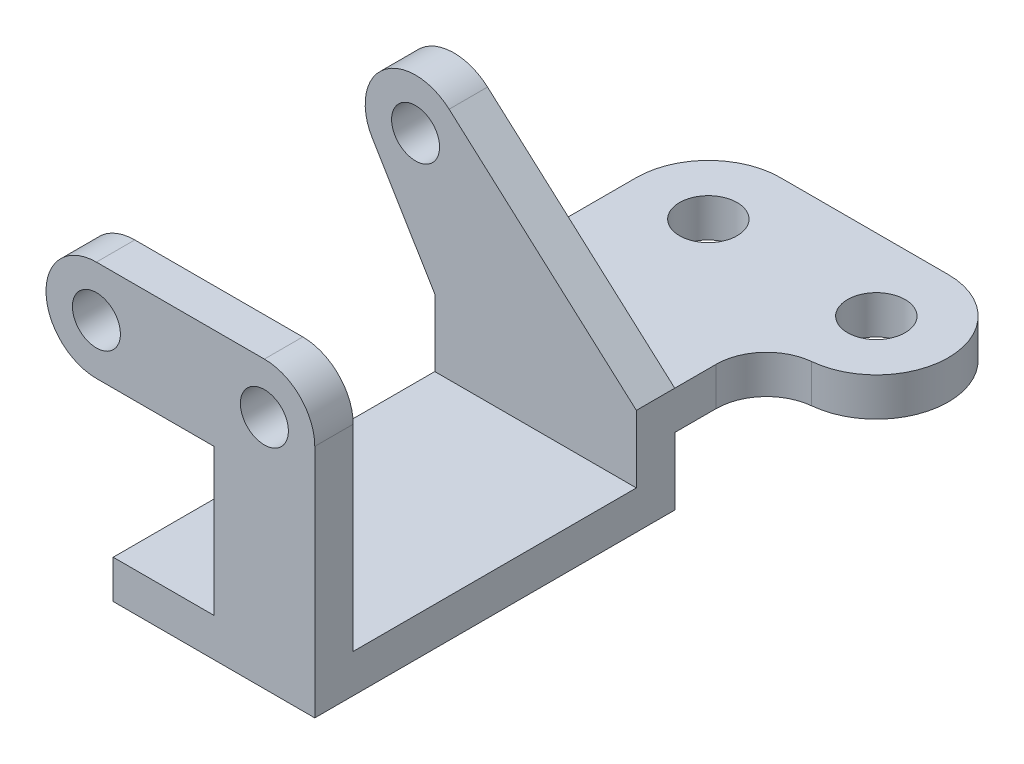
ISO-10303-21;
HEADER;
FILE_DESCRIPTION(('STEP AP214'),'2;1');
FILE_NAME('part.step','',(''),(''),'','','');
FILE_SCHEMA(('AUTOMOTIVE_DESIGN { 1 0 10303 214 1 1 1 1 }'));
ENDSEC;
DATA;
#1=APPLICATION_CONTEXT('core data for automotive mechanical design processes');
#2=APPLICATION_PROTOCOL_DEFINITION('international standard','automotive_design',2000,#1);
#3=PRODUCT_CONTEXT('',#1,'mechanical');
#4=PRODUCT('Part','Part','',(#3));
#5=PRODUCT_RELATED_PRODUCT_CATEGORY('part','',(#4));
#6=PRODUCT_DEFINITION_FORMATION('','',#4);
#7=PRODUCT_DEFINITION_CONTEXT('part definition',#1,'design');
#8=PRODUCT_DEFINITION('design','',#6,#7);
#9=PRODUCT_DEFINITION_SHAPE('','',#8);
#10=(LENGTH_UNIT() NAMED_UNIT(*) SI_UNIT(.MILLI.,.METRE.));
#11=(NAMED_UNIT(*) PLANE_ANGLE_UNIT() SI_UNIT($,.RADIAN.));
#12=(NAMED_UNIT(*) SI_UNIT($,.STERADIAN.) SOLID_ANGLE_UNIT());
#13=UNCERTAINTY_MEASURE_WITH_UNIT(LENGTH_MEASURE(1.E-05),#10,'distance_accuracy_value','');
#14=(GEOMETRIC_REPRESENTATION_CONTEXT(3) GLOBAL_UNCERTAINTY_ASSIGNED_CONTEXT((#13)) GLOBAL_UNIT_ASSIGNED_CONTEXT((#10,
#11,#12)) REPRESENTATION_CONTEXT('',''));
#15=CARTESIAN_POINT('',(0.,0.,0.));
#16=DIRECTION('',(0.,0.,1.));
#17=DIRECTION('',(1.,0.,0.));
#18=AXIS2_PLACEMENT_3D('',#15,#16,#17);
#19=CARTESIAN_POINT('',(42.,0.,0.));
#20=DIRECTION('',(0.,-1.,0.));
#21=DIRECTION('',(0.,0.,-1.));
#22=AXIS2_PLACEMENT_3D('',#19,#20,#21);
#23=PLANE('',#22);
#24=DIRECTION('',(0.,0.,1.));
#25=VECTOR('',#24,1.);
#26=CARTESIAN_POINT('',(0.,0.,118.));
#27=LINE('',#26,#25);
#28=CARTESIAN_POINT('',(0.,0.,118.));
#29=VERTEX_POINT('',#28);
#30=CARTESIAN_POINT('',(0.,0.,134.));
#31=VERTEX_POINT('',#30);
#32=EDGE_CURVE('E223',#29,#31,#27,.T.);
#33=ORIENTED_EDGE('',*,*,#32,.F.);
#34=DIRECTION('',(-1.,0.,0.));
#35=VECTOR('',#34,1.);
#36=CARTESIAN_POINT('',(0.,0.,118.));
#37=LINE('',#36,#35);
#38=CARTESIAN_POINT('',(42.,0.,118.));
#39=VERTEX_POINT('',#38);
#40=EDGE_CURVE('E180',#39,#29,#37,.T.);
#41=ORIENTED_EDGE('',*,*,#40,.F.);
#42=DIRECTION('',(0.,0.,1.));
#43=VECTOR('',#42,1.);
#44=CARTESIAN_POINT('',(42.,0.,0.));
#45=LINE('',#44,#43);
#46=CARTESIAN_POINT('',(42.,0.,0.));
#47=VERTEX_POINT('',#46);
#48=EDGE_CURVE('E187',#47,#39,#45,.T.);
#49=ORIENTED_EDGE('',*,*,#48,.F.);
#50=DIRECTION('',(-1.,0.,0.));
#51=VECTOR('',#50,1.);
#52=CARTESIAN_POINT('',(42.,0.,0.));
#53=LINE('',#52,#51);
#54=CARTESIAN_POINT('',(-42.,0.,0.));
#55=VERTEX_POINT('',#54);
#56=EDGE_CURVE('E343',#47,#55,#53,.T.);
#57=ORIENTED_EDGE('',*,*,#56,.T.);
#58=DIRECTION('',(0.,0.,1.));
#59=VECTOR('',#58,1.);
#60=CARTESIAN_POINT('',(-42.,0.,0.));
#61=LINE('',#60,#59);
#62=CARTESIAN_POINT('',(-42.,0.,134.));
#63=VERTEX_POINT('',#62);
#64=EDGE_CURVE('E318',#55,#63,#61,.T.);
#65=ORIENTED_EDGE('',*,*,#64,.T.);
#66=DIRECTION('',(-1.,0.,0.));
#67=VECTOR('',#66,1.);
#68=CARTESIAN_POINT('',(42.,0.,134.));
#69=LINE('',#68,#67);
#70=EDGE_CURVE('E341',#31,#63,#69,.T.);
#71=ORIENTED_EDGE('',*,*,#70,.F.);
#72=EDGE_LOOP('',(#33,#41,#49,#57,#65,#71));
#73=FACE_BOUND('',#72,.T.);
#74=ADVANCED_FACE('F35',(#73),#23,.F.);
#75=CARTESIAN_POINT('',(42.,28.,-84.));
#76=DIRECTION('',(0.,-1.,0.));
#77=DIRECTION('',(0.,0.,-1.));
#78=AXIS2_PLACEMENT_3D('',#75,#76,#77);
#79=PLANE('',#78);
#80=CARTESIAN_POINT('',(58.,28.,-84.));
#81=DIRECTION('',(0.,1.,0.));
#82=DIRECTION('',(0.,0.,1.));
#83=AXIS2_PLACEMENT_3D('',#80,#81,#82);
#84=CIRCLE('',#83,12.);
#85=CARTESIAN_POINT('',(58.,28.,-72.));
#86=VERTEX_POINT('',#85);
#87=EDGE_CURVE('E233',#86,#86,#84,.T.);
#88=ORIENTED_EDGE('',*,*,#87,.F.);
#89=EDGE_LOOP('',(#88));
#90=FACE_BOUND('',#89,.T.);
#91=CARTESIAN_POINT('',(-12.,28.,-84.));
#92=DIRECTION('',(0.,1.,0.));
#93=DIRECTION('',(0.,0.,1.));
#94=AXIS2_PLACEMENT_3D('',#91,#92,#93);
#95=CIRCLE('',#94,12.);
#96=CARTESIAN_POINT('',(-12.,28.,-72.));
#97=VERTEX_POINT('',#96);
#98=EDGE_CURVE('E237',#97,#97,#95,.T.);
#99=ORIENTED_EDGE('',*,*,#98,.F.);
#100=EDGE_LOOP('',(#99));
#101=FACE_BOUND('',#100,.T.);
#102=DIRECTION('',(0.,0.,1.));
#103=VECTOR('',#102,1.);
#104=CARTESIAN_POINT('',(42.,28.,-84.));
#105=LINE('',#104,#103);
#106=CARTESIAN_POINT('',(42.,28.,-33.245689838202));
#107=VERTEX_POINT('',#106);
#108=CARTESIAN_POINT('',(42.,28.,-16.));
#109=VERTEX_POINT('',#108);
#110=EDGE_CURVE('E313',#107,#109,#105,.T.);
#111=ORIENTED_EDGE('',*,*,#110,.F.);
#112=CARTESIAN_POINT('',(63.,28.,-33.245689838202));
#113=DIRECTION('',(0.,-1.,0.));
#114=DIRECTION('',(0.,0.,-1.));
#115=AXIS2_PLACEMENT_3D('',#112,#113,#114);
#116=CIRCLE('',#115,21.);
#117=CARTESIAN_POINT('',(60.9411764705882,28.,-54.1445234342365));
#118=VERTEX_POINT('',#117);
#119=EDGE_CURVE('E43',#107,#118,#116,.T.);
#120=ORIENTED_EDGE('',*,*,#119,.T.);
#121=CARTESIAN_POINT('',(58.,28.,-84.));
#122=DIRECTION('',(0.,1.,0.));
#123=DIRECTION('',(0.,0.,1.));
#124=AXIS2_PLACEMENT_3D('',#121,#122,#123);
#125=CIRCLE('',#124,30.);
#126=CARTESIAN_POINT('',(58.,28.,-114.));
#127=VERTEX_POINT('',#126);
#128=EDGE_CURVE('E249',#118,#127,#125,.T.);
#129=ORIENTED_EDGE('',*,*,#128,.T.);
#130=DIRECTION('',(1.,0.,0.));
#131=VECTOR('',#130,1.);
#132=CARTESIAN_POINT('',(0.,28.,-114.));
#133=LINE('',#132,#131);
#134=CARTESIAN_POINT('',(-12.,28.,-114.));
#135=VERTEX_POINT('',#134);
#136=EDGE_CURVE('E240',#135,#127,#133,.T.);
#137=ORIENTED_EDGE('',*,*,#136,.F.);
#138=CARTESIAN_POINT('',(-12.,28.,-84.));
#139=DIRECTION('',(0.,1.,0.));
#140=DIRECTION('',(0.,0.,1.));
#141=AXIS2_PLACEMENT_3D('',#138,#139,#140);
#142=CIRCLE('',#141,30.);
#143=CARTESIAN_POINT('',(-42.,28.,-84.));
#144=VERTEX_POINT('',#143);
#145=EDGE_CURVE('E257',#135,#144,#142,.T.);
#146=ORIENTED_EDGE('',*,*,#145,.T.);
#147=DIRECTION('',(0.,0.,1.));
#148=VECTOR('',#147,1.);
#149=CARTESIAN_POINT('',(-42.,28.,-84.));
#150=LINE('',#149,#148);
#151=CARTESIAN_POINT('',(-42.,28.,-16.));
#152=VERTEX_POINT('',#151);
#153=EDGE_CURVE('E303',#144,#152,#150,.T.);
#154=ORIENTED_EDGE('',*,*,#153,.T.);
#155=DIRECTION('',(-1.,0.,0.));
#156=VECTOR('',#155,1.);
#157=CARTESIAN_POINT('',(0.,28.,-16.));
#158=LINE('',#157,#156);
#159=EDGE_CURVE('E281',#109,#152,#158,.T.);
#160=ORIENTED_EDGE('',*,*,#159,.F.);
#161=EDGE_LOOP('',(#111,#120,#129,#137,#146,#154,#160));
#162=FACE_BOUND('',#161,.T.);
#163=ADVANCED_FACE('F354',(#90,#101,#162),#79,.F.);
#164=CARTESIAN_POINT('',(42.,28.,0.));
#165=DIRECTION('',(0.,0.,-1.));
#166=DIRECTION('',(0.,1.,0.));
#167=AXIS2_PLACEMENT_3D('',#164,#165,#166);
#168=PLANE('',#167);
#169=CARTESIAN_POINT('',(-50.,82.,0.));
#170=DIRECTION('',(0.,0.,1.));
#171=DIRECTION('',(1.,0.,0.));
#172=AXIS2_PLACEMENT_3D('',#169,#170,#171);
#173=CIRCLE('',#172,10.);
#174=CARTESIAN_POINT('',(-40.,82.,0.));
#175=VERTEX_POINT('',#174);
#176=EDGE_CURVE('E264',#175,#175,#173,.T.);
#177=ORIENTED_EDGE('',*,*,#176,.F.);
#178=EDGE_LOOP('',(#177));
#179=FACE_BOUND('',#178,.T.);
#180=DIRECTION('',(0.,-1.,0.));
#181=VECTOR('',#180,1.);
#182=CARTESIAN_POINT('',(-42.,28.,0.));
#183=LINE('',#182,#181);
#184=CARTESIAN_POINT('',(-42.,28.,0.));
#185=VERTEX_POINT('',#184);
#186=EDGE_CURVE('E294',#185,#55,#183,.T.);
#187=ORIENTED_EDGE('',*,*,#186,.T.);
#188=ORIENTED_EDGE('',*,*,#56,.F.);
#189=DIRECTION('',(0.,-1.,0.));
#190=VECTOR('',#189,1.);
#191=CARTESIAN_POINT('',(42.,28.,0.));
#192=LINE('',#191,#190);
#193=CARTESIAN_POINT('',(42.,28.,0.));
#194=VERTEX_POINT('',#193);
#195=EDGE_CURVE('E301',#194,#47,#192,.T.);
#196=ORIENTED_EDGE('',*,*,#195,.F.);
#197=DIRECTION('',(-0.745891919922251,0.666066996476104,0.));
#198=VECTOR('',#197,1.);
#199=CARTESIAN_POINT('',(32.5438919817328,36.4441207872816,0.));
#200=LINE('',#199,#198);
#201=CARTESIAN_POINT('',(-36.0125930740018,97.6637303183673,0.));
#202=VERTEX_POINT('',#201);
#203=EDGE_CURVE('E271',#194,#202,#200,.T.);
#204=ORIENTED_EDGE('',*,*,#203,.T.);
#205=CARTESIAN_POINT('',(-50.,82.,0.));
#206=DIRECTION('',(0.,0.,1.));
#207=DIRECTION('',(1.,0.,0.));
#208=AXIS2_PLACEMENT_3D('',#205,#206,#207);
#209=CIRCLE('',#208,21.);
#210=CARTESIAN_POINT('',(-67.9907880905346,71.1680313939949,0.));
#211=VERTEX_POINT('',#210);
#212=EDGE_CURVE('E287',#202,#211,#209,.T.);
#213=ORIENTED_EDGE('',*,*,#212,.T.);
#214=DIRECTION('',(-0.515808028857387,0.856704194787359,0.));
#215=VECTOR('',#214,1.);
#216=CARTESIAN_POINT('',(-18.4525099926234,-11.1099640513943,0.));
#217=LINE('',#216,#215);
#218=EDGE_CURVE('E276',#185,#211,#217,.T.);
#219=ORIENTED_EDGE('',*,*,#218,.F.);
#220=EDGE_LOOP('',(#187,#188,#196,#204,#213,#219));
#221=FACE_BOUND('',#220,.T.);
#222=ADVANCED_FACE('F372',(#179,#221),#168,.F.);
#223=CARTESIAN_POINT('',(42.,0.,134.));
#224=DIRECTION('',(0.,0.,-1.));
#225=DIRECTION('',(-1.,0.,0.));
#226=AXIS2_PLACEMENT_3D('',#223,#224,#225);
#227=PLANE('',#226);
#228=CARTESIAN_POINT('',(-49.,82.,134.));
#229=DIRECTION('',(0.,0.,1.));
#230=DIRECTION('',(1.,0.,0.));
#231=AXIS2_PLACEMENT_3D('',#228,#229,#230);
#232=CIRCLE('',#231,10.);
#233=CARTESIAN_POINT('',(-39.,82.,134.));
#234=VERTEX_POINT('',#233);
#235=EDGE_CURVE('E670',#234,#234,#232,.T.);
#236=ORIENTED_EDGE('',*,*,#235,.F.);
#237=EDGE_LOOP('',(#236));
#238=FACE_BOUND('',#237,.T.);
#239=CARTESIAN_POINT('',(21.,82.,134.));
#240=DIRECTION('',(0.,0.,1.));
#241=DIRECTION('',(1.,0.,0.));
#242=AXIS2_PLACEMENT_3D('',#239,#240,#241);
#243=CIRCLE('',#242,10.);
#244=CARTESIAN_POINT('',(31.,82.,134.));
#245=VERTEX_POINT('',#244);
#246=EDGE_CURVE('E671',#245,#245,#243,.T.);
#247=ORIENTED_EDGE('',*,*,#246,.F.);
#248=EDGE_LOOP('',(#247));
#249=FACE_BOUND('',#248,.T.);
#250=DIRECTION('',(0.,-1.,0.));
#251=VECTOR('',#250,1.);
#252=CARTESIAN_POINT('',(-42.,0.,134.));
#253=LINE('',#252,#251);
#254=CARTESIAN_POINT('',(-42.,-16.,134.));
#255=VERTEX_POINT('',#254);
#256=EDGE_CURVE('E321',#63,#255,#253,.T.);
#257=ORIENTED_EDGE('',*,*,#256,.T.);
#258=DIRECTION('',(-1.,0.,0.));
#259=VECTOR('',#258,1.);
#260=CARTESIAN_POINT('',(42.,-16.,134.));
#261=LINE('',#260,#259);
#262=CARTESIAN_POINT('',(42.,-16.,134.));
#263=VERTEX_POINT('',#262);
#264=EDGE_CURVE('E338',#263,#255,#261,.T.);
#265=ORIENTED_EDGE('',*,*,#264,.F.);
#266=DIRECTION('',(0.,-1.,0.));
#267=VECTOR('',#266,1.);
#268=CARTESIAN_POINT('',(42.,0.,134.));
#269=LINE('',#268,#267);
#270=CARTESIAN_POINT('',(42.,82.,134.));
#271=VERTEX_POINT('',#270);
#272=EDGE_CURVE('E305',#271,#263,#269,.T.);
#273=ORIENTED_EDGE('',*,*,#272,.F.);
#274=CARTESIAN_POINT('',(21.,82.,134.));
#275=DIRECTION('',(0.,0.,1.));
#276=DIRECTION('',(1.,0.,0.));
#277=AXIS2_PLACEMENT_3D('',#274,#275,#276);
#278=CIRCLE('',#277,21.);
#279=CARTESIAN_POINT('',(21.,103.,134.));
#280=VERTEX_POINT('',#279);
#281=EDGE_CURVE('E177',#271,#280,#278,.T.);
#282=ORIENTED_EDGE('',*,*,#281,.T.);
#283=DIRECTION('',(1.,0.,0.));
#284=VECTOR('',#283,1.);
#285=CARTESIAN_POINT('',(0.,103.,134.));
#286=LINE('',#285,#284);
#287=CARTESIAN_POINT('',(-49.,103.,134.));
#288=VERTEX_POINT('',#287);
#289=EDGE_CURVE('E211',#288,#280,#286,.T.);
#290=ORIENTED_EDGE('',*,*,#289,.F.);
#291=CARTESIAN_POINT('',(-49.,82.,134.));
#292=DIRECTION('',(0.,0.,1.));
#293=DIRECTION('',(1.,0.,0.));
#294=AXIS2_PLACEMENT_3D('',#291,#292,#293);
#295=CIRCLE('',#294,21.);
#296=CARTESIAN_POINT('',(-49.,61.,134.));
#297=VERTEX_POINT('',#296);
#298=EDGE_CURVE('E215',#288,#297,#295,.T.);
#299=ORIENTED_EDGE('',*,*,#298,.T.);
#300=DIRECTION('',(1.,0.,0.));
#301=VECTOR('',#300,1.);
#302=CARTESIAN_POINT('',(0.,61.,134.));
#303=LINE('',#302,#301);
#304=CARTESIAN_POINT('',(0.,61.,134.));
#305=VERTEX_POINT('',#304);
#306=EDGE_CURVE('E218',#297,#305,#303,.T.);
#307=ORIENTED_EDGE('',*,*,#306,.T.);
#308=DIRECTION('',(0.,1.,0.));
#309=VECTOR('',#308,1.);
#310=CARTESIAN_POINT('',(0.,0.,134.));
#311=LINE('',#310,#309);
#312=EDGE_CURVE('E190',#31,#305,#311,.T.);
#313=ORIENTED_EDGE('',*,*,#312,.F.);
#314=ORIENTED_EDGE('',*,*,#70,.T.);
#315=EDGE_LOOP('',(#257,#265,#273,#282,#290,#299,#307,#313,#314));
#316=FACE_BOUND('',#315,.T.);
#317=ADVANCED_FACE('F394',(#238,#249,#316),#227,.F.);
#318=CARTESIAN_POINT('',(42.,-16.,134.));
#319=DIRECTION('',(0.,1.,0.));
#320=DIRECTION('',(0.,0.,1.));
#321=AXIS2_PLACEMENT_3D('',#318,#319,#320);
#322=PLANE('',#321);
#323=DIRECTION('',(0.,0.,-1.));
#324=VECTOR('',#323,1.);
#325=CARTESIAN_POINT('',(-42.,-16.,134.));
#326=LINE('',#325,#324);
#327=CARTESIAN_POINT('',(-42.,-16.,-16.));
#328=VERTEX_POINT('',#327);
#329=EDGE_CURVE('E323',#255,#328,#326,.T.);
#330=ORIENTED_EDGE('',*,*,#329,.T.);
#331=DIRECTION('',(-1.,0.,0.));
#332=VECTOR('',#331,1.);
#333=CARTESIAN_POINT('',(42.,-16.,-16.));
#334=LINE('',#333,#332);
#335=CARTESIAN_POINT('',(42.,-16.,-16.));
#336=VERTEX_POINT('',#335);
#337=EDGE_CURVE('E335',#336,#328,#334,.T.);
#338=ORIENTED_EDGE('',*,*,#337,.F.);
#339=DIRECTION('',(0.,0.,-1.));
#340=VECTOR('',#339,1.);
#341=CARTESIAN_POINT('',(42.,-16.,134.));
#342=LINE('',#341,#340);
#343=EDGE_CURVE('E307',#263,#336,#342,.T.);
#344=ORIENTED_EDGE('',*,*,#343,.F.);
#345=ORIENTED_EDGE('',*,*,#264,.T.);
#346=EDGE_LOOP('',(#330,#338,#344,#345));
#347=FACE_BOUND('',#346,.T.);
#348=ADVANCED_FACE('F401',(#347),#322,.F.);
#349=CARTESIAN_POINT('',(42.,-16.,-16.));
#350=DIRECTION('',(0.,0.,1.));
#351=DIRECTION('',(0.,-1.,0.));
#352=AXIS2_PLACEMENT_3D('',#349,#350,#351);
#353=PLANE('',#352);
#354=DIRECTION('',(0.,1.,0.));
#355=VECTOR('',#354,1.);
#356=CARTESIAN_POINT('',(-42.,-16.,-16.));
#357=LINE('',#356,#355);
#358=CARTESIAN_POINT('',(-42.,12.,-16.));
#359=VERTEX_POINT('',#358);
#360=EDGE_CURVE('E325',#328,#359,#357,.T.);
#361=ORIENTED_EDGE('',*,*,#360,.T.);
#362=DIRECTION('',(-1.,0.,0.));
#363=VECTOR('',#362,1.);
#364=CARTESIAN_POINT('',(42.,12.,-16.));
#365=LINE('',#364,#363);
#366=CARTESIAN_POINT('',(42.,12.,-16.));
#367=VERTEX_POINT('',#366);
#368=EDGE_CURVE('E315',#367,#359,#365,.T.);
#369=ORIENTED_EDGE('',*,*,#368,.F.);
#370=DIRECTION('',(0.,1.,0.));
#371=VECTOR('',#370,1.);
#372=CARTESIAN_POINT('',(42.,-16.,-16.));
#373=LINE('',#372,#371);
#374=EDGE_CURVE('E309',#336,#367,#373,.T.);
#375=ORIENTED_EDGE('',*,*,#374,.F.);
#376=ORIENTED_EDGE('',*,*,#337,.T.);
#377=EDGE_LOOP('',(#361,#369,#375,#376));
#378=FACE_BOUND('',#377,.T.);
#379=ADVANCED_FACE('F405',(#378),#353,.F.);
#380=CARTESIAN_POINT('',(42.,12.,-16.));
#381=DIRECTION('',(0.,1.,0.));
#382=DIRECTION('',(0.,0.,1.));
#383=AXIS2_PLACEMENT_3D('',#380,#381,#382);
#384=PLANE('',#383);
#385=CARTESIAN_POINT('',(58.,12.,-84.));
#386=DIRECTION('',(0.,1.,0.));
#387=DIRECTION('',(0.,0.,1.));
#388=AXIS2_PLACEMENT_3D('',#385,#386,#387);
#389=CIRCLE('',#388,12.);
#390=CARTESIAN_POINT('',(58.,12.,-72.));
#391=VERTEX_POINT('',#390);
#392=EDGE_CURVE('E236',#391,#391,#389,.F.);
#393=ORIENTED_EDGE('',*,*,#392,.F.);
#394=EDGE_LOOP('',(#393));
#395=FACE_BOUND('',#394,.T.);
#396=CARTESIAN_POINT('',(-12.,12.,-84.));
#397=DIRECTION('',(0.,1.,0.));
#398=DIRECTION('',(0.,0.,1.));
#399=AXIS2_PLACEMENT_3D('',#396,#397,#398);
#400=CIRCLE('',#399,12.);
#401=CARTESIAN_POINT('',(-12.,12.,-72.));
#402=VERTEX_POINT('',#401);
#403=EDGE_CURVE('E225',#402,#402,#400,.F.);
#404=ORIENTED_EDGE('',*,*,#403,.F.);
#405=EDGE_LOOP('',(#404));
#406=FACE_BOUND('',#405,.T.);
#407=CARTESIAN_POINT('',(58.,12.,-84.));
#408=DIRECTION('',(0.,1.,0.));
#409=DIRECTION('',(0.,0.,1.));
#410=AXIS2_PLACEMENT_3D('',#407,#408,#409);
#411=CIRCLE('',#410,30.);
#412=CARTESIAN_POINT('',(60.9411764705882,12.,-54.1445234342365));
#413=VERTEX_POINT('',#412);
#414=CARTESIAN_POINT('',(58.,12.,-114.));
#415=VERTEX_POINT('',#414);
#416=EDGE_CURVE('E252',#413,#415,#411,.T.);
#417=ORIENTED_EDGE('',*,*,#416,.F.);
#418=CARTESIAN_POINT('',(63.,12.,-33.245689838202));
#419=DIRECTION('',(0.,1.,0.));
#420=DIRECTION('',(0.,0.,1.));
#421=AXIS2_PLACEMENT_3D('',#418,#419,#420);
#422=CIRCLE('',#421,21.);
#423=CARTESIAN_POINT('',(42.,12.,-33.245689838202));
#424=VERTEX_POINT('',#423);
#425=EDGE_CURVE('E11',#413,#424,#422,.T.);
#426=ORIENTED_EDGE('',*,*,#425,.T.);
#427=DIRECTION('',(0.,0.,-1.));
#428=VECTOR('',#427,1.);
#429=CARTESIAN_POINT('',(42.,12.,-16.));
#430=LINE('',#429,#428);
#431=EDGE_CURVE('E311',#367,#424,#430,.T.);
#432=ORIENTED_EDGE('',*,*,#431,.F.);
#433=ORIENTED_EDGE('',*,*,#368,.T.);
#434=DIRECTION('',(0.,0.,-1.));
#435=VECTOR('',#434,1.);
#436=CARTESIAN_POINT('',(-42.,12.,-16.));
#437=LINE('',#436,#435);
#438=CARTESIAN_POINT('',(-42.,12.,-84.));
#439=VERTEX_POINT('',#438);
#440=EDGE_CURVE('E327',#359,#439,#437,.T.);
#441=ORIENTED_EDGE('',*,*,#440,.T.);
#442=CARTESIAN_POINT('',(-12.,12.,-84.));
#443=DIRECTION('',(0.,1.,0.));
#444=DIRECTION('',(0.,0.,1.));
#445=AXIS2_PLACEMENT_3D('',#442,#443,#444);
#446=CIRCLE('',#445,30.);
#447=CARTESIAN_POINT('',(-12.,12.,-114.));
#448=VERTEX_POINT('',#447);
#449=EDGE_CURVE('E248',#448,#439,#446,.T.);
#450=ORIENTED_EDGE('',*,*,#449,.F.);
#451=DIRECTION('',(1.,0.,0.));
#452=VECTOR('',#451,1.);
#453=CARTESIAN_POINT('',(0.,12.,-114.));
#454=LINE('',#453,#452);
#455=EDGE_CURVE('E245',#448,#415,#454,.T.);
#456=ORIENTED_EDGE('',*,*,#455,.T.);
#457=EDGE_LOOP('',(#417,#426,#432,#433,#441,#450,#456));
#458=FACE_BOUND('',#457,.T.);
#459=ADVANCED_FACE('F408',(#395,#406,#458),#384,.F.);
#460=CARTESIAN_POINT('',(42.,0.,0.));
#461=DIRECTION('',(-1.,0.,0.));
#462=DIRECTION('',(0.,0.,1.));
#463=AXIS2_PLACEMENT_3D('',#460,#461,#462);
#464=PLANE('',#463);
#465=ORIENTED_EDGE('',*,*,#431,.T.);
#466=DIRECTION('',(0.,1.,0.));
#467=VECTOR('',#466,1.);
#468=CARTESIAN_POINT('',(42.,0.,-33.245689838202));
#469=LINE('',#468,#467);
#470=EDGE_CURVE('E346',#424,#107,#469,.T.);
#471=ORIENTED_EDGE('',*,*,#470,.T.);
#472=ORIENTED_EDGE('',*,*,#110,.T.);
#473=DIRECTION('',(0.,0.,1.));
#474=VECTOR('',#473,1.);
#475=CARTESIAN_POINT('',(42.,28.,-16.));
#476=LINE('',#475,#474);
#477=EDGE_CURVE('E292',#109,#194,#476,.T.);
#478=ORIENTED_EDGE('',*,*,#477,.T.);
#479=ORIENTED_EDGE('',*,*,#195,.T.);
#480=ORIENTED_EDGE('',*,*,#48,.T.);
#481=DIRECTION('',(0.,-1.,0.));
#482=VECTOR('',#481,1.);
#483=CARTESIAN_POINT('',(42.,0.,118.));
#484=LINE('',#483,#482);
#485=CARTESIAN_POINT('',(42.,82.,118.));
#486=VERTEX_POINT('',#485);
#487=EDGE_CURVE('E183',#486,#39,#484,.T.);
#488=ORIENTED_EDGE('',*,*,#487,.F.);
#489=DIRECTION('',(0.,0.,1.));
#490=VECTOR('',#489,1.);
#491=CARTESIAN_POINT('',(42.,82.,118.));
#492=LINE('',#491,#490);
#493=EDGE_CURVE('E171',#486,#271,#492,.T.);
#494=ORIENTED_EDGE('',*,*,#493,.T.);
#495=ORIENTED_EDGE('',*,*,#272,.T.);
#496=ORIENTED_EDGE('',*,*,#343,.T.);
#497=ORIENTED_EDGE('',*,*,#374,.T.);
#498=EDGE_LOOP('',(#465,#471,#472,#478,#479,#480,#488,#494,#495,#496,#497));
#499=FACE_BOUND('',#498,.T.);
#500=ADVANCED_FACE('F185',(#499),#464,.F.);
#501=CARTESIAN_POINT('',(-42.,0.,0.));
#502=DIRECTION('',(-1.,0.,0.));
#503=DIRECTION('',(0.,0.,1.));
#504=AXIS2_PLACEMENT_3D('',#501,#502,#503);
#505=PLANE('',#504);
#506=ORIENTED_EDGE('',*,*,#186,.F.);
#507=DIRECTION('',(0.,0.,1.));
#508=VECTOR('',#507,1.);
#509=CARTESIAN_POINT('',(-42.,28.,-16.));
#510=LINE('',#509,#508);
#511=EDGE_CURVE('E295',#152,#185,#510,.T.);
#512=ORIENTED_EDGE('',*,*,#511,.F.);
#513=ORIENTED_EDGE('',*,*,#153,.F.);
#514=DIRECTION('',(0.,1.,0.));
#515=VECTOR('',#514,1.);
#516=CARTESIAN_POINT('',(-42.,12.,-84.));
#517=LINE('',#516,#515);
#518=EDGE_CURVE('E329',#439,#144,#517,.T.);
#519=ORIENTED_EDGE('',*,*,#518,.F.);
#520=ORIENTED_EDGE('',*,*,#440,.F.);
#521=ORIENTED_EDGE('',*,*,#360,.F.);
#522=ORIENTED_EDGE('',*,*,#329,.F.);
#523=ORIENTED_EDGE('',*,*,#256,.F.);
#524=ORIENTED_EDGE('',*,*,#64,.F.);
#525=EDGE_LOOP('',(#506,#512,#513,#519,#520,#521,#522,#523,#524));
#526=FACE_BOUND('',#525,.T.);
#527=ADVANCED_FACE('F460',(#526),#505,.T.);
#528=CARTESIAN_POINT('',(32.5438919817328,36.4441207872816,-16.));
#529=DIRECTION('',(0.666066996476104,0.745891919922251,0.));
#530=DIRECTION('',(-0.745891919922251,0.666066996476104,0.));
#531=AXIS2_PLACEMENT_3D('',#528,#529,#530);
#532=PLANE('',#531);
#533=ORIENTED_EDGE('',*,*,#203,.F.);
#534=ORIENTED_EDGE('',*,*,#477,.F.);
#535=DIRECTION('',(-0.745891919922251,0.666066996476104,0.));
#536=VECTOR('',#535,1.);
#537=CARTESIAN_POINT('',(32.5438919817328,36.4441207872816,-16.));
#538=LINE('',#537,#536);
#539=CARTESIAN_POINT('',(-36.0125930740018,97.6637303183673,-16.));
#540=VERTEX_POINT('',#539);
#541=EDGE_CURVE('E272',#109,#540,#538,.T.);
#542=ORIENTED_EDGE('',*,*,#541,.T.);
#543=DIRECTION('',(0.,0.,1.));
#544=VECTOR('',#543,1.);
#545=CARTESIAN_POINT('',(-36.0125930740018,97.6637303183673,-16.));
#546=LINE('',#545,#544);
#547=EDGE_CURVE('E284',#540,#202,#546,.T.);
#548=ORIENTED_EDGE('',*,*,#547,.T.);
#549=EDGE_LOOP('',(#533,#534,#542,#548));
#550=FACE_BOUND('',#549,.T.);
#551=ADVANCED_FACE('F362',(#550),#532,.T.);
#552=CARTESIAN_POINT('',(-18.4525099926234,-11.1099640513943,-16.));
#553=DIRECTION('',(0.856704194787359,0.515808028857387,0.));
#554=DIRECTION('',(-0.515808028857387,0.856704194787359,0.));
#555=AXIS2_PLACEMENT_3D('',#552,#553,#554);
#556=PLANE('',#555);
#557=ORIENTED_EDGE('',*,*,#218,.T.);
#558=DIRECTION('',(0.,0.,1.));
#559=VECTOR('',#558,1.);
#560=CARTESIAN_POINT('',(-67.9907880905346,71.1680313939949,-16.));
#561=LINE('',#560,#559);
#562=CARTESIAN_POINT('',(-67.9907880905346,71.1680313939949,-16.));
#563=VERTEX_POINT('',#562);
#564=EDGE_CURVE('E298',#563,#211,#561,.T.);
#565=ORIENTED_EDGE('',*,*,#564,.F.);
#566=DIRECTION('',(-0.515808028857387,0.856704194787359,0.));
#567=VECTOR('',#566,1.);
#568=CARTESIAN_POINT('',(-18.4525099926234,-11.1099640513943,-16.));
#569=LINE('',#568,#567);
#570=EDGE_CURVE('E279',#152,#563,#569,.T.);
#571=ORIENTED_EDGE('',*,*,#570,.F.);
#572=ORIENTED_EDGE('',*,*,#511,.T.);
#573=EDGE_LOOP('',(#557,#565,#571,#572));
#574=FACE_BOUND('',#573,.T.);
#575=ADVANCED_FACE('F452',(#574),#556,.F.);
#576=CARTESIAN_POINT('',(-50.,82.,-16.));
#577=DIRECTION('',(0.,0.,1.));
#578=DIRECTION('',(1.,0.,0.));
#579=AXIS2_PLACEMENT_3D('',#576,#577,#578);
#580=CYLINDRICAL_SURFACE('',#579,21.);
#581=ORIENTED_EDGE('',*,*,#212,.F.);
#582=ORIENTED_EDGE('',*,*,#547,.F.);
#583=CARTESIAN_POINT('',(-50.,82.,-16.));
#584=DIRECTION('',(0.,0.,1.));
#585=DIRECTION('',(1.,0.,0.));
#586=AXIS2_PLACEMENT_3D('',#583,#584,#585);
#587=CIRCLE('',#586,21.);
#588=EDGE_CURVE('E275',#540,#563,#587,.T.);
#589=ORIENTED_EDGE('',*,*,#588,.T.);
#590=ORIENTED_EDGE('',*,*,#564,.T.);
#591=EDGE_LOOP('',(#581,#582,#589,#590));
#592=FACE_BOUND('',#591,.T.);
#593=ADVANCED_FACE('F369',(#592),#580,.T.);
#594=CARTESIAN_POINT('',(0.,0.,-16.));
#595=DIRECTION('',(0.,0.,1.));
#596=DIRECTION('',(1.,0.,0.));
#597=AXIS2_PLACEMENT_3D('',#594,#595,#596);
#598=PLANE('',#597);
#599=CARTESIAN_POINT('',(-50.,82.,-16.));
#600=DIRECTION('',(0.,0.,1.));
#601=DIRECTION('',(1.,0.,0.));
#602=AXIS2_PLACEMENT_3D('',#599,#600,#601);
#603=CIRCLE('',#602,10.);
#604=CARTESIAN_POINT('',(-40.,82.,-16.));
#605=VERTEX_POINT('',#604);
#606=EDGE_CURVE('E268',#605,#605,#603,.F.);
#607=ORIENTED_EDGE('',*,*,#606,.F.);
#608=EDGE_LOOP('',(#607));
#609=FACE_BOUND('',#608,.T.);
#610=ORIENTED_EDGE('',*,*,#541,.F.);
#611=ORIENTED_EDGE('',*,*,#159,.T.);
#612=ORIENTED_EDGE('',*,*,#570,.T.);
#613=ORIENTED_EDGE('',*,*,#588,.F.);
#614=EDGE_LOOP('',(#610,#611,#612,#613));
#615=FACE_BOUND('',#614,.T.);
#616=ADVANCED_FACE('F365',(#609,#615),#598,.F.);
#617=CARTESIAN_POINT('',(-50.,82.,-44.2842712474619));
#618=DIRECTION('',(0.,0.,1.));
#619=DIRECTION('',(1.,0.,0.));
#620=AXIS2_PLACEMENT_3D('',#617,#618,#619);
#621=CYLINDRICAL_SURFACE('',#620,10.);
#622=ORIENTED_EDGE('',*,*,#606,.T.);
#623=EDGE_LOOP('',(#622));
#624=FACE_BOUND('',#623,.T.);
#625=ORIENTED_EDGE('',*,*,#176,.T.);
#626=EDGE_LOOP('',(#625));
#627=FACE_BOUND('',#626,.T.);
#628=ADVANCED_FACE('F436',(#624,#627),#621,.F.);
#629=CARTESIAN_POINT('',(0.,12.,-114.));
#630=DIRECTION('',(0.,0.,1.));
#631=DIRECTION('',(0.,-1.,0.));
#632=AXIS2_PLACEMENT_3D('',#629,#630,#631);
#633=PLANE('',#632);
#634=ORIENTED_EDGE('',*,*,#136,.T.);
#635=DIRECTION('',(0.,1.,0.));
#636=VECTOR('',#635,1.);
#637=CARTESIAN_POINT('',(58.,12.,-114.));
#638=LINE('',#637,#636);
#639=EDGE_CURVE('E261',#415,#127,#638,.T.);
#640=ORIENTED_EDGE('',*,*,#639,.F.);
#641=ORIENTED_EDGE('',*,*,#455,.F.);
#642=DIRECTION('',(0.,1.,0.));
#643=VECTOR('',#642,1.);
#644=CARTESIAN_POINT('',(-12.,12.,-114.));
#645=LINE('',#644,#643);
#646=EDGE_CURVE('E254',#448,#135,#645,.T.);
#647=ORIENTED_EDGE('',*,*,#646,.T.);
#648=EDGE_LOOP('',(#634,#640,#641,#647));
#649=FACE_BOUND('',#648,.T.);
#650=ADVANCED_FACE('F438',(#649),#633,.F.);
#651=CARTESIAN_POINT('',(58.,12.,-84.));
#652=DIRECTION('',(0.,1.,0.));
#653=DIRECTION('',(0.,0.,1.));
#654=AXIS2_PLACEMENT_3D('',#651,#652,#653);
#655=CYLINDRICAL_SURFACE('',#654,30.);
#656=ORIENTED_EDGE('',*,*,#128,.F.);
#657=DIRECTION('',(0.,1.,0.));
#658=VECTOR('',#657,1.);
#659=CARTESIAN_POINT('',(60.9411764705882,12.,-54.1445234342365));
#660=LINE('',#659,#658);
#661=EDGE_CURVE('E50',#118,#413,#660,.F.);
#662=ORIENTED_EDGE('',*,*,#661,.T.);
#663=ORIENTED_EDGE('',*,*,#416,.T.);
#664=ORIENTED_EDGE('',*,*,#639,.T.);
#665=EDGE_LOOP('',(#656,#662,#663,#664));
#666=FACE_BOUND('',#665,.T.);
#667=ADVANCED_FACE('F445',(#666),#655,.T.);
#668=CARTESIAN_POINT('',(-12.,12.,-84.));
#669=DIRECTION('',(0.,1.,0.));
#670=DIRECTION('',(0.,0.,1.));
#671=AXIS2_PLACEMENT_3D('',#668,#669,#670);
#672=CYLINDRICAL_SURFACE('',#671,30.);
#673=ORIENTED_EDGE('',*,*,#449,.T.);
#674=ORIENTED_EDGE('',*,*,#518,.T.);
#675=ORIENTED_EDGE('',*,*,#145,.F.);
#676=ORIENTED_EDGE('',*,*,#646,.F.);
#677=EDGE_LOOP('',(#673,#674,#675,#676));
#678=FACE_BOUND('',#677,.T.);
#679=ADVANCED_FACE('F553',(#678),#672,.T.);
#680=CARTESIAN_POINT('',(-12.,-21.9411254969543,-84.));
#681=DIRECTION('',(0.,1.,0.));
#682=DIRECTION('',(0.,0.,1.));
#683=AXIS2_PLACEMENT_3D('',#680,#681,#682);
#684=CYLINDRICAL_SURFACE('',#683,12.);
#685=CARTESIAN_POINT('',(-12.,12.,-72.));
#686=CARTESIAN_POINT('',(-12.,12.1666666666667,-72.));
#687=CARTESIAN_POINT('',(-12.,12.3333333333333,-72.));
#688=CARTESIAN_POINT('',(-12.,12.6666666666667,-72.));
#689=CARTESIAN_POINT('',(-12.,12.8333333333333,-72.));
#690=CARTESIAN_POINT('',(-12.,13.1666666666667,-72.));
#691=CARTESIAN_POINT('',(-12.,13.3333333333333,-72.));
#692=CARTESIAN_POINT('',(-12.,13.6666666666667,-72.));
#693=CARTESIAN_POINT('',(-12.,13.8333333333333,-72.));
#694=CARTESIAN_POINT('',(-12.,14.1666666666667,-72.));
#695=CARTESIAN_POINT('',(-12.,14.3333333333333,-72.));
#696=CARTESIAN_POINT('',(-12.,14.6666666666667,-72.));
#697=CARTESIAN_POINT('',(-12.,14.8333333333333,-72.));
#698=CARTESIAN_POINT('',(-12.,15.1666666666667,-72.));
#699=CARTESIAN_POINT('',(-12.,15.3333333333333,-72.));
#700=CARTESIAN_POINT('',(-12.,15.6666666666667,-72.));
#701=CARTESIAN_POINT('',(-12.,15.8333333333333,-72.));
#702=CARTESIAN_POINT('',(-12.,16.1666666666667,-72.));
#703=CARTESIAN_POINT('',(-12.,16.3333333333333,-72.));
#704=CARTESIAN_POINT('',(-12.,16.6666666666667,-72.));
#705=CARTESIAN_POINT('',(-12.,16.8333333333333,-72.));
#706=CARTESIAN_POINT('',(-12.,17.1666666666667,-72.));
#707=CARTESIAN_POINT('',(-12.,17.3333333333333,-72.));
#708=CARTESIAN_POINT('',(-12.,17.6666666666667,-72.));
#709=CARTESIAN_POINT('',(-12.,17.8333333333333,-72.));
#710=CARTESIAN_POINT('',(-12.,18.1666666666667,-72.));
#711=CARTESIAN_POINT('',(-12.,18.3333333333333,-72.));
#712=CARTESIAN_POINT('',(-12.,18.6666666666667,-72.));
#713=CARTESIAN_POINT('',(-12.,18.8333333333333,-72.));
#714=CARTESIAN_POINT('',(-12.,19.1666666666667,-72.));
#715=CARTESIAN_POINT('',(-12.,19.3333333333333,-72.));
#716=CARTESIAN_POINT('',(-12.,19.6666666666667,-72.));
#717=CARTESIAN_POINT('',(-12.,19.8333333333333,-72.));
#718=CARTESIAN_POINT('',(-12.,20.1666666666667,-72.));
#719=CARTESIAN_POINT('',(-12.,20.3333333333333,-72.));
#720=CARTESIAN_POINT('',(-12.,20.6666666666667,-72.));
#721=CARTESIAN_POINT('',(-12.,20.8333333333333,-72.));
#722=CARTESIAN_POINT('',(-12.,21.1666666666667,-72.));
#723=CARTESIAN_POINT('',(-12.,21.3333333333333,-72.));
#724=CARTESIAN_POINT('',(-12.,21.6666666666667,-72.));
#725=CARTESIAN_POINT('',(-12.,21.8333333333333,-72.));
#726=CARTESIAN_POINT('',(-12.,22.1666666666667,-72.));
#727=CARTESIAN_POINT('',(-12.,22.3333333333333,-72.));
#728=CARTESIAN_POINT('',(-12.,22.6666666666667,-72.));
#729=CARTESIAN_POINT('',(-12.,22.8333333333333,-72.));
#730=CARTESIAN_POINT('',(-12.,23.1666666666667,-72.));
#731=CARTESIAN_POINT('',(-12.,23.3333333333333,-72.));
#732=CARTESIAN_POINT('',(-12.,23.6666666666667,-72.));
#733=CARTESIAN_POINT('',(-12.,23.8333333333333,-72.));
#734=CARTESIAN_POINT('',(-12.,24.1666666666667,-72.));
#735=CARTESIAN_POINT('',(-12.,24.3333333333333,-72.));
#736=CARTESIAN_POINT('',(-12.,24.6666666666667,-72.));
#737=CARTESIAN_POINT('',(-12.,24.8333333333333,-72.));
#738=CARTESIAN_POINT('',(-12.,25.1666666666667,-72.));
#739=CARTESIAN_POINT('',(-12.,25.3333333333333,-72.));
#740=CARTESIAN_POINT('',(-12.,25.6666666666667,-72.));
#741=CARTESIAN_POINT('',(-12.,25.8333333333333,-72.));
#742=CARTESIAN_POINT('',(-12.,26.1666666666667,-72.));
#743=CARTESIAN_POINT('',(-12.,26.3333333333333,-72.));
#744=CARTESIAN_POINT('',(-12.,26.6666666666667,-72.));
#745=CARTESIAN_POINT('',(-12.,26.8333333333333,-72.));
#746=CARTESIAN_POINT('',(-12.,27.1666666666667,-72.));
#747=CARTESIAN_POINT('',(-12.,27.3333333333333,-72.));
#748=CARTESIAN_POINT('',(-12.,27.6666666666667,-72.));
#749=CARTESIAN_POINT('',(-12.,27.8333333333333,-72.));
#750=CARTESIAN_POINT('',(-12.,28.,-72.));
#751=B_SPLINE_CURVE_WITH_KNOTS('',3,(#685,#686,#687,#688,#689,#690,#691,#692,#693,#694,#695,
#696,#697,#698,#699,#700,#701,#702,#703,#704,#705,#706,#707,#708,#709,#710,#711,#712,#713,#714,
#715,#716,#717,#718,#719,#720,#721,#722,#723,#724,#725,#726,#727,#728,#729,#730,#731,#732,#733,
#734,#735,#736,#737,#738,#739,#740,#741,#742,#743,#744,#745,#746,#747,#748,#749,#750),
.UNSPECIFIED.,.F.,.F.,(4,2,2,2,2,2,2,2,2,2,2,2,2,2,2,2,2,2,2,2,2,2,2,2,2,2,2,2,2,2,2,2,4),(0.,
0.5,1.,1.5,2.,2.5,3.,3.5,4.,4.5,5.,5.5,6.,6.5,7.,7.5,8.,8.5,9.,9.5,10.,10.5,11.,11.5,12.,12.5,
13.,13.5,14.,14.5,15.,15.5,16.),.UNSPECIFIED.);
#752=EDGE_CURVE('BSEAM416',#402,#97,#751,.T.);
#753=ORIENTED_EDGE('',*,*,#403,.T.);
#754=ORIENTED_EDGE('',*,*,#98,.T.);
#755=ORIENTED_EDGE('',*,*,#752,.T.);
#756=ORIENTED_EDGE('',*,*,#752,.F.);
#757=EDGE_LOOP('',(#753,#755,#754,#756));
#758=FACE_BOUND('',#757,.T.);
#759=ADVANCED_FACE('F416',(#758),#684,.F.);
#760=CARTESIAN_POINT('',(58.,-21.9411254969543,-84.));
#761=DIRECTION('',(0.,1.,0.));
#762=DIRECTION('',(0.,0.,1.));
#763=AXIS2_PLACEMENT_3D('',#760,#761,#762);
#764=CYLINDRICAL_SURFACE('',#763,12.);
#765=CARTESIAN_POINT('',(58.,12.,-72.));
#766=CARTESIAN_POINT('',(58.,12.1666666666667,-72.));
#767=CARTESIAN_POINT('',(58.,12.3333333333333,-72.));
#768=CARTESIAN_POINT('',(58.,12.6666666666667,-72.));
#769=CARTESIAN_POINT('',(58.,12.8333333333333,-72.));
#770=CARTESIAN_POINT('',(58.,13.1666666666667,-72.));
#771=CARTESIAN_POINT('',(58.,13.3333333333333,-72.));
#772=CARTESIAN_POINT('',(58.,13.6666666666667,-72.));
#773=CARTESIAN_POINT('',(58.,13.8333333333333,-72.));
#774=CARTESIAN_POINT('',(58.,14.1666666666667,-72.));
#775=CARTESIAN_POINT('',(58.,14.3333333333333,-72.));
#776=CARTESIAN_POINT('',(58.,14.6666666666667,-72.));
#777=CARTESIAN_POINT('',(58.,14.8333333333333,-72.));
#778=CARTESIAN_POINT('',(58.,15.1666666666667,-72.));
#779=CARTESIAN_POINT('',(58.,15.3333333333333,-72.));
#780=CARTESIAN_POINT('',(58.,15.6666666666667,-72.));
#781=CARTESIAN_POINT('',(58.,15.8333333333333,-72.));
#782=CARTESIAN_POINT('',(58.,16.1666666666667,-72.));
#783=CARTESIAN_POINT('',(58.,16.3333333333333,-72.));
#784=CARTESIAN_POINT('',(58.,16.6666666666667,-72.));
#785=CARTESIAN_POINT('',(58.,16.8333333333333,-72.));
#786=CARTESIAN_POINT('',(58.,17.1666666666667,-72.));
#787=CARTESIAN_POINT('',(58.,17.3333333333333,-72.));
#788=CARTESIAN_POINT('',(58.,17.6666666666667,-72.));
#789=CARTESIAN_POINT('',(58.,17.8333333333333,-72.));
#790=CARTESIAN_POINT('',(58.,18.1666666666667,-72.));
#791=CARTESIAN_POINT('',(58.,18.3333333333333,-72.));
#792=CARTESIAN_POINT('',(58.,18.6666666666667,-72.));
#793=CARTESIAN_POINT('',(58.,18.8333333333333,-72.));
#794=CARTESIAN_POINT('',(58.,19.1666666666667,-72.));
#795=CARTESIAN_POINT('',(58.,19.3333333333333,-72.));
#796=CARTESIAN_POINT('',(58.,19.6666666666667,-72.));
#797=CARTESIAN_POINT('',(58.,19.8333333333333,-72.));
#798=CARTESIAN_POINT('',(58.,20.1666666666667,-72.));
#799=CARTESIAN_POINT('',(58.,20.3333333333333,-72.));
#800=CARTESIAN_POINT('',(58.,20.6666666666667,-72.));
#801=CARTESIAN_POINT('',(58.,20.8333333333333,-72.));
#802=CARTESIAN_POINT('',(58.,21.1666666666667,-72.));
#803=CARTESIAN_POINT('',(58.,21.3333333333333,-72.));
#804=CARTESIAN_POINT('',(58.,21.6666666666667,-72.));
#805=CARTESIAN_POINT('',(58.,21.8333333333333,-72.));
#806=CARTESIAN_POINT('',(58.,22.1666666666667,-72.));
#807=CARTESIAN_POINT('',(58.,22.3333333333333,-72.));
#808=CARTESIAN_POINT('',(58.,22.6666666666667,-72.));
#809=CARTESIAN_POINT('',(58.,22.8333333333333,-72.));
#810=CARTESIAN_POINT('',(58.,23.1666666666667,-72.));
#811=CARTESIAN_POINT('',(58.,23.3333333333333,-72.));
#812=CARTESIAN_POINT('',(58.,23.6666666666667,-72.));
#813=CARTESIAN_POINT('',(58.,23.8333333333333,-72.));
#814=CARTESIAN_POINT('',(58.,24.1666666666667,-72.));
#815=CARTESIAN_POINT('',(58.,24.3333333333333,-72.));
#816=CARTESIAN_POINT('',(58.,24.6666666666667,-72.));
#817=CARTESIAN_POINT('',(58.,24.8333333333333,-72.));
#818=CARTESIAN_POINT('',(58.,25.1666666666667,-72.));
#819=CARTESIAN_POINT('',(58.,25.3333333333333,-72.));
#820=CARTESIAN_POINT('',(58.,25.6666666666667,-72.));
#821=CARTESIAN_POINT('',(58.,25.8333333333333,-72.));
#822=CARTESIAN_POINT('',(58.,26.1666666666667,-72.));
#823=CARTESIAN_POINT('',(58.,26.3333333333333,-72.));
#824=CARTESIAN_POINT('',(58.,26.6666666666667,-72.));
#825=CARTESIAN_POINT('',(58.,26.8333333333333,-72.));
#826=CARTESIAN_POINT('',(58.,27.1666666666667,-72.));
#827=CARTESIAN_POINT('',(58.,27.3333333333333,-72.));
#828=CARTESIAN_POINT('',(58.,27.6666666666667,-72.));
#829=CARTESIAN_POINT('',(58.,27.8333333333333,-72.));
#830=CARTESIAN_POINT('',(58.,28.,-72.));
#831=B_SPLINE_CURVE_WITH_KNOTS('',3,(#765,#766,#767,#768,#769,#770,#771,#772,#773,#774,#775,
#776,#777,#778,#779,#780,#781,#782,#783,#784,#785,#786,#787,#788,#789,#790,#791,#792,#793,#794,
#795,#796,#797,#798,#799,#800,#801,#802,#803,#804,#805,#806,#807,#808,#809,#810,#811,#812,#813,
#814,#815,#816,#817,#818,#819,#820,#821,#822,#823,#824,#825,#826,#827,#828,#829,#830),
.UNSPECIFIED.,.F.,.F.,(4,2,2,2,2,2,2,2,2,2,2,2,2,2,2,2,2,2,2,2,2,2,2,2,2,2,2,2,2,2,2,2,4),(0.,
0.5,1.,1.5,2.,2.5,3.,3.5,4.,4.5,5.,5.5,6.,6.5,7.,7.5,8.,8.5,9.,9.5,10.,10.5,11.,11.5,12.,12.5,
13.,13.5,14.,14.5,15.,15.5,16.),.UNSPECIFIED.);
#832=EDGE_CURVE('BSEAM410',#391,#86,#831,.T.);
#833=ORIENTED_EDGE('',*,*,#392,.T.);
#834=ORIENTED_EDGE('',*,*,#87,.T.);
#835=ORIENTED_EDGE('',*,*,#832,.T.);
#836=ORIENTED_EDGE('',*,*,#832,.F.);
#837=EDGE_LOOP('',(#833,#835,#834,#836));
#838=FACE_BOUND('',#837,.T.);
#839=ADVANCED_FACE('F410',(#838),#764,.F.);
#840=CARTESIAN_POINT('',(63.,12.,-33.245689838202));
#841=DIRECTION('',(0.,1.,0.));
#842=DIRECTION('',(0.,0.,1.));
#843=AXIS2_PLACEMENT_3D('',#840,#841,#842);
#844=CYLINDRICAL_SURFACE('',#843,21.);
#845=ORIENTED_EDGE('',*,*,#425,.F.);
#846=ORIENTED_EDGE('',*,*,#661,.F.);
#847=ORIENTED_EDGE('',*,*,#119,.F.);
#848=ORIENTED_EDGE('',*,*,#470,.F.);
#849=EDGE_LOOP('',(#845,#846,#847,#848));
#850=FACE_BOUND('',#849,.T.);
#851=ADVANCED_FACE('F37',(#850),#844,.F.);
#852=CARTESIAN_POINT('',(0.,0.,118.));
#853=DIRECTION('',(1.,0.,0.));
#854=DIRECTION('',(0.,1.,0.));
#855=AXIS2_PLACEMENT_3D('',#852,#853,#854);
#856=PLANE('',#855);
#857=ORIENTED_EDGE('',*,*,#312,.T.);
#858=DIRECTION('',(0.,0.,1.));
#859=VECTOR('',#858,1.);
#860=CARTESIAN_POINT('',(0.,61.,118.));
#861=LINE('',#860,#859);
#862=CARTESIAN_POINT('',(0.,61.,118.));
#863=VERTEX_POINT('',#862);
#864=EDGE_CURVE('E226',#863,#305,#861,.T.);
#865=ORIENTED_EDGE('',*,*,#864,.F.);
#866=DIRECTION('',(0.,1.,0.));
#867=VECTOR('',#866,1.);
#868=CARTESIAN_POINT('',(0.,0.,118.));
#869=LINE('',#868,#867);
#870=EDGE_CURVE('E207',#29,#863,#869,.T.);
#871=ORIENTED_EDGE('',*,*,#870,.F.);
#872=ORIENTED_EDGE('',*,*,#32,.T.);
#873=EDGE_LOOP('',(#857,#865,#871,#872));
#874=FACE_BOUND('',#873,.T.);
#875=ADVANCED_FACE('F382',(#874),#856,.F.);
#876=CARTESIAN_POINT('',(0.,61.,118.));
#877=DIRECTION('',(0.,-1.,0.));
#878=DIRECTION('',(0.,0.,-1.));
#879=AXIS2_PLACEMENT_3D('',#876,#877,#878);
#880=PLANE('',#879);
#881=ORIENTED_EDGE('',*,*,#306,.F.);
#882=DIRECTION('',(0.,0.,1.));
#883=VECTOR('',#882,1.);
#884=CARTESIAN_POINT('',(-49.,61.,118.));
#885=LINE('',#884,#883);
#886=CARTESIAN_POINT('',(-49.,61.,118.));
#887=VERTEX_POINT('',#886);
#888=EDGE_CURVE('E228',#887,#297,#885,.T.);
#889=ORIENTED_EDGE('',*,*,#888,.F.);
#890=DIRECTION('',(1.,0.,0.));
#891=VECTOR('',#890,1.);
#892=CARTESIAN_POINT('',(0.,61.,118.));
#893=LINE('',#892,#891);
#894=EDGE_CURVE('E204',#887,#863,#893,.T.);
#895=ORIENTED_EDGE('',*,*,#894,.T.);
#896=ORIENTED_EDGE('',*,*,#864,.T.);
#897=EDGE_LOOP('',(#881,#889,#895,#896));
#898=FACE_BOUND('',#897,.T.);
#899=ADVANCED_FACE('F386',(#898),#880,.T.);
#900=CARTESIAN_POINT('',(-49.,82.,118.));
#901=DIRECTION('',(0.,0.,1.));
#902=DIRECTION('',(1.,0.,0.));
#903=AXIS2_PLACEMENT_3D('',#900,#901,#902);
#904=CYLINDRICAL_SURFACE('',#903,21.);
#905=ORIENTED_EDGE('',*,*,#298,.F.);
#906=DIRECTION('',(0.,0.,1.));
#907=VECTOR('',#906,1.);
#908=CARTESIAN_POINT('',(-49.,103.,118.));
#909=LINE('',#908,#907);
#910=CARTESIAN_POINT('',(-49.,103.,118.));
#911=VERTEX_POINT('',#910);
#912=EDGE_CURVE('E230',#911,#288,#909,.T.);
#913=ORIENTED_EDGE('',*,*,#912,.F.);
#914=CARTESIAN_POINT('',(-49.,82.,118.));
#915=DIRECTION('',(0.,0.,1.));
#916=DIRECTION('',(1.,0.,0.));
#917=AXIS2_PLACEMENT_3D('',#914,#915,#916);
#918=CIRCLE('',#917,21.);
#919=EDGE_CURVE('E198',#911,#887,#918,.T.);
#920=ORIENTED_EDGE('',*,*,#919,.T.);
#921=ORIENTED_EDGE('',*,*,#888,.T.);
#922=EDGE_LOOP('',(#905,#913,#920,#921));
#923=FACE_BOUND('',#922,.T.);
#924=ADVANCED_FACE('F389',(#923),#904,.T.);
#925=CARTESIAN_POINT('',(0.,103.,118.));
#926=DIRECTION('',(0.,-1.,0.));
#927=DIRECTION('',(0.,0.,-1.));
#928=AXIS2_PLACEMENT_3D('',#925,#926,#927);
#929=PLANE('',#928);
#930=ORIENTED_EDGE('',*,*,#289,.T.);
#931=DIRECTION('',(0.,0.,1.));
#932=VECTOR('',#931,1.);
#933=CARTESIAN_POINT('',(21.,103.,118.));
#934=LINE('',#933,#932);
#935=CARTESIAN_POINT('',(21.,103.,118.));
#936=VERTEX_POINT('',#935);
#937=EDGE_CURVE('E179',#936,#280,#934,.T.);
#938=ORIENTED_EDGE('',*,*,#937,.F.);
#939=DIRECTION('',(1.,0.,0.));
#940=VECTOR('',#939,1.);
#941=CARTESIAN_POINT('',(0.,103.,118.));
#942=LINE('',#941,#940);
#943=EDGE_CURVE('E195',#911,#936,#942,.T.);
#944=ORIENTED_EDGE('',*,*,#943,.F.);
#945=ORIENTED_EDGE('',*,*,#912,.T.);
#946=EDGE_LOOP('',(#930,#938,#944,#945));
#947=FACE_BOUND('',#946,.T.);
#948=ADVANCED_FACE('F392',(#947),#929,.F.);
#949=CARTESIAN_POINT('',(21.,82.,118.));
#950=DIRECTION('',(0.,0.,1.));
#951=DIRECTION('',(1.,0.,0.));
#952=AXIS2_PLACEMENT_3D('',#949,#950,#951);
#953=CYLINDRICAL_SURFACE('',#952,21.);
#954=ORIENTED_EDGE('',*,*,#281,.F.);
#955=ORIENTED_EDGE('',*,*,#493,.F.);
#956=CARTESIAN_POINT('',(21.,82.,118.));
#957=DIRECTION('',(0.,0.,1.));
#958=DIRECTION('',(1.,0.,0.));
#959=AXIS2_PLACEMENT_3D('',#956,#957,#958);
#960=CIRCLE('',#959,21.);
#961=EDGE_CURVE('E175',#486,#936,#960,.T.);
#962=ORIENTED_EDGE('',*,*,#961,.T.);
#963=ORIENTED_EDGE('',*,*,#937,.T.);
#964=EDGE_LOOP('',(#954,#955,#962,#963));
#965=FACE_BOUND('',#964,.T.);
#966=ADVANCED_FACE('F173',(#965),#953,.T.);
#967=CARTESIAN_POINT('',(0.,0.,118.));
#968=DIRECTION('',(0.,0.,1.));
#969=DIRECTION('',(1.,0.,0.));
#970=AXIS2_PLACEMENT_3D('',#967,#968,#969);
#971=PLANE('',#970);
#972=CARTESIAN_POINT('',(-49.,82.,118.));
#973=DIRECTION('',(0.,0.,1.));
#974=DIRECTION('',(1.,0.,0.));
#975=AXIS2_PLACEMENT_3D('',#972,#973,#974);
#976=CIRCLE('',#975,10.);
#977=CARTESIAN_POINT('',(-39.,82.,118.));
#978=VERTEX_POINT('',#977);
#979=EDGE_CURVE('E212',#978,#978,#976,.F.);
#980=ORIENTED_EDGE('',*,*,#979,.F.);
#981=EDGE_LOOP('',(#980));
#982=FACE_BOUND('',#981,.T.);
#983=CARTESIAN_POINT('',(21.,82.,118.));
#984=DIRECTION('',(0.,0.,1.));
#985=DIRECTION('',(1.,0.,0.));
#986=AXIS2_PLACEMENT_3D('',#983,#984,#985);
#987=CIRCLE('',#986,10.);
#988=CARTESIAN_POINT('',(31.,82.,118.));
#989=VERTEX_POINT('',#988);
#990=EDGE_CURVE('E675',#989,#989,#987,.F.);
#991=ORIENTED_EDGE('',*,*,#990,.F.);
#992=EDGE_LOOP('',(#991));
#993=FACE_BOUND('',#992,.T.);
#994=ORIENTED_EDGE('',*,*,#487,.T.);
#995=ORIENTED_EDGE('',*,*,#40,.T.);
#996=ORIENTED_EDGE('',*,*,#870,.T.);
#997=ORIENTED_EDGE('',*,*,#894,.F.);
#998=ORIENTED_EDGE('',*,*,#919,.F.);
#999=ORIENTED_EDGE('',*,*,#943,.T.);
#1000=ORIENTED_EDGE('',*,*,#961,.F.);
#1001=EDGE_LOOP('',(#994,#995,#996,#997,#998,#999,#1000));
#1002=FACE_BOUND('',#1001,.T.);
#1003=ADVANCED_FACE('F192',(#982,#993,#1002),#971,.F.);
#1004=CARTESIAN_POINT('',(21.,82.,89.7157287525381));
#1005=DIRECTION('',(0.,0.,1.));
#1006=DIRECTION('',(1.,0.,0.));
#1007=AXIS2_PLACEMENT_3D('',#1004,#1005,#1006);
#1008=CYLINDRICAL_SURFACE('',#1007,10.);
#1009=ORIENTED_EDGE('',*,*,#990,.T.);
#1010=EDGE_LOOP('',(#1009));
#1011=FACE_BOUND('',#1010,.T.);
#1012=ORIENTED_EDGE('',*,*,#246,.T.);
#1013=EDGE_LOOP('',(#1012));
#1014=FACE_BOUND('',#1013,.T.);
#1015=ADVANCED_FACE('F634',(#1011,#1014),#1008,.F.);
#1016=CARTESIAN_POINT('',(-49.,82.,89.7157287525381));
#1017=DIRECTION('',(0.,0.,1.));
#1018=DIRECTION('',(1.,0.,0.));
#1019=AXIS2_PLACEMENT_3D('',#1016,#1017,#1018);
#1020=CYLINDRICAL_SURFACE('',#1019,10.);
#1021=ORIENTED_EDGE('',*,*,#979,.T.);
#1022=EDGE_LOOP('',(#1021));
#1023=FACE_BOUND('',#1022,.T.);
#1024=ORIENTED_EDGE('',*,*,#235,.T.);
#1025=EDGE_LOOP('',(#1024));
#1026=FACE_BOUND('',#1025,.T.);
#1027=ADVANCED_FACE('F646',(#1023,#1026),#1020,.F.);
#1028=CLOSED_SHELL('',(#74,#163,#222,#317,#348,#379,#459,#500,#527,#551,#575,#593,#616,#628,
#650,#667,#679,#759,#839,#851,#875,#899,#924,#948,#966,#1003,#1015,#1027));
#1029=MANIFOLD_SOLID_BREP('B2',#1028);
#1030=ADVANCED_BREP_SHAPE_REPRESENTATION('',(#18,#1029),#14);
#1031=SHAPE_DEFINITION_REPRESENTATION(#9,#1030);
ENDSEC;
END-ISO-10303-21;
